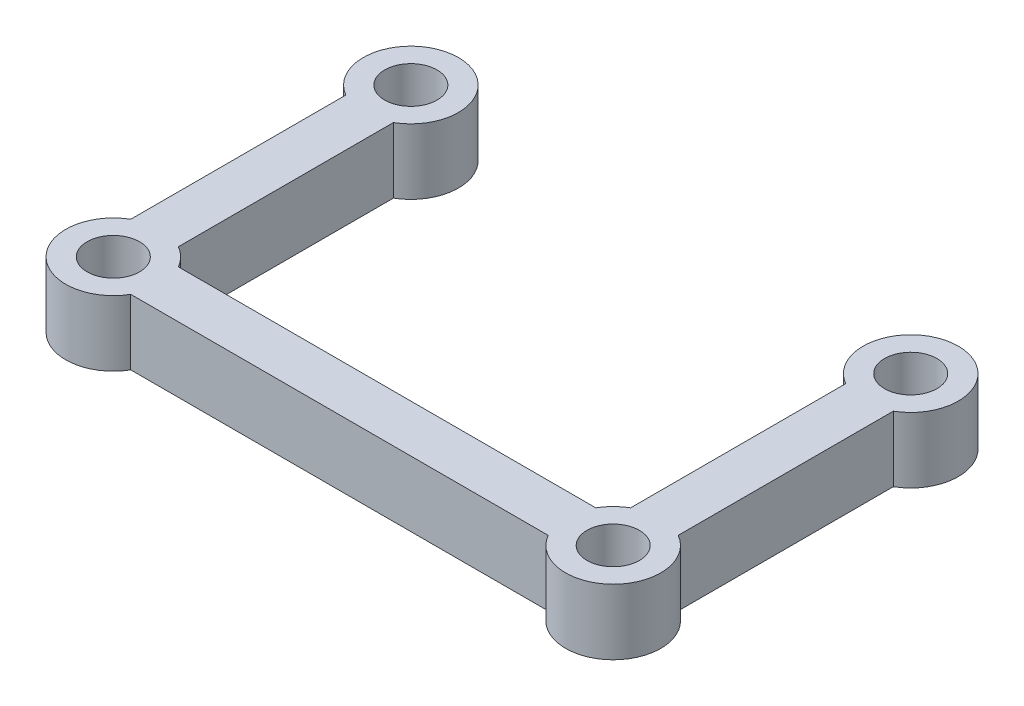
ISO-10303-21;
HEADER;
FILE_DESCRIPTION(('STEP AP214'),'2;1');
FILE_NAME('part.step','',(''),(''),'','','');
FILE_SCHEMA(('AUTOMOTIVE_DESIGN { 1 0 10303 214 1 1 1 1 }'));
ENDSEC;
DATA;
#1=APPLICATION_CONTEXT('core data for automotive mechanical design processes');
#2=APPLICATION_PROTOCOL_DEFINITION('international standard','automotive_design',2000,#1);
#3=PRODUCT_CONTEXT('',#1,'mechanical');
#4=PRODUCT('Part','Part','',(#3));
#5=PRODUCT_RELATED_PRODUCT_CATEGORY('part','',(#4));
#6=PRODUCT_DEFINITION_FORMATION('','',#4);
#7=PRODUCT_DEFINITION_CONTEXT('part definition',#1,'design');
#8=PRODUCT_DEFINITION('design','',#6,#7);
#9=PRODUCT_DEFINITION_SHAPE('','',#8);
#10=(LENGTH_UNIT() NAMED_UNIT(*) SI_UNIT(.MILLI.,.METRE.));
#11=(NAMED_UNIT(*) PLANE_ANGLE_UNIT() SI_UNIT($,.RADIAN.));
#12=(NAMED_UNIT(*) SI_UNIT($,.STERADIAN.) SOLID_ANGLE_UNIT());
#13=UNCERTAINTY_MEASURE_WITH_UNIT(LENGTH_MEASURE(1.E-05),#10,'distance_accuracy_value','');
#14=(GEOMETRIC_REPRESENTATION_CONTEXT(3) GLOBAL_UNCERTAINTY_ASSIGNED_CONTEXT((#13)) GLOBAL_UNIT_ASSIGNED_CONTEXT((#10,
#11,#12)) REPRESENTATION_CONTEXT('',''));
#15=CARTESIAN_POINT('',(0.,0.,0.));
#16=DIRECTION('',(0.,0.,1.));
#17=DIRECTION('',(1.,0.,0.));
#18=AXIS2_PLACEMENT_3D('',#15,#16,#17);
#19=CARTESIAN_POINT('',(-21.,2.75,0.));
#20=DIRECTION('',(0.,-1.,0.));
#21=DIRECTION('',(0.,0.,-1.));
#22=AXIS2_PLACEMENT_3D('',#19,#20,#21);
#23=CYLINDRICAL_SURFACE('',#22,2.);
#24=CARTESIAN_POINT('',(-21.,0.,0.));
#25=DIRECTION('',(0.,1.,0.));
#26=DIRECTION('',(0.,0.,1.));
#27=AXIS2_PLACEMENT_3D('',#24,#25,#26);
#28=CIRCLE('',#27,2.);
#29=CARTESIAN_POINT('',(-19.2679491924311,0.,-1.));
#30=VERTEX_POINT('',#29);
#31=CARTESIAN_POINT('',(-20.,0.,-1.73205080756887));
#32=VERTEX_POINT('',#31);
#33=EDGE_CURVE('E164',#30,#32,#28,.T.);
#34=ORIENTED_EDGE('',*,*,#33,.T.);
#35=DIRECTION('',(0.,-1.,0.));
#36=VECTOR('',#35,1.);
#37=CARTESIAN_POINT('',(-20.,2.75,-1.73205080756887));
#38=LINE('',#37,#36);
#39=CARTESIAN_POINT('',(-20.,2.75,-1.73205080756887));
#40=VERTEX_POINT('',#39);
#41=EDGE_CURVE('E11',#40,#32,#38,.T.);
#42=ORIENTED_EDGE('',*,*,#41,.F.);
#43=CARTESIAN_POINT('',(-21.,2.75,0.));
#44=DIRECTION('',(0.,1.,0.));
#45=DIRECTION('',(0.,0.,1.));
#46=AXIS2_PLACEMENT_3D('',#43,#44,#45);
#47=CIRCLE('',#46,2.);
#48=CARTESIAN_POINT('',(-19.2679491924311,2.75,-1.));
#49=VERTEX_POINT('',#48);
#50=EDGE_CURVE('E199',#49,#40,#47,.T.);
#51=ORIENTED_EDGE('',*,*,#50,.F.);
#52=DIRECTION('',(0.,-1.,0.));
#53=VECTOR('',#52,1.);
#54=CARTESIAN_POINT('',(-19.2679491924311,2.75,-1.));
#55=LINE('',#54,#53);
#56=EDGE_CURVE('E160',#49,#30,#55,.T.);
#57=ORIENTED_EDGE('',*,*,#56,.T.);
#58=EDGE_LOOP('',(#34,#42,#51,#57));
#59=FACE_BOUND('',#58,.T.);
#60=ADVANCED_FACE('F39',(#59),#23,.T.);
#61=CARTESIAN_POINT('',(-20.,2.75,-10.7679491924311));
#62=DIRECTION('',(-1.,0.,0.));
#63=DIRECTION('',(0.,0.,1.));
#64=AXIS2_PLACEMENT_3D('',#61,#62,#63);
#65=PLANE('',#64);
#66=DIRECTION('',(0.,0.,-1.));
#67=VECTOR('',#66,1.);
#68=CARTESIAN_POINT('',(-20.,0.,-10.7679491924311));
#69=LINE('',#68,#67);
#70=CARTESIAN_POINT('',(-20.,0.,-10.7679491924311));
#71=VERTEX_POINT('',#70);
#72=EDGE_CURVE('E168',#32,#71,#69,.T.);
#73=ORIENTED_EDGE('',*,*,#72,.T.);
#74=DIRECTION('',(0.,-1.,0.));
#75=VECTOR('',#74,1.);
#76=CARTESIAN_POINT('',(-20.,2.75,-10.7679491924311));
#77=LINE('',#76,#75);
#78=CARTESIAN_POINT('',(-20.,2.75,-10.7679491924311));
#79=VERTEX_POINT('',#78);
#80=EDGE_CURVE('E48',#79,#71,#77,.T.);
#81=ORIENTED_EDGE('',*,*,#80,.F.);
#82=DIRECTION('',(0.,0.,-1.));
#83=VECTOR('',#82,1.);
#84=CARTESIAN_POINT('',(-20.,2.75,-10.7679491924311));
#85=LINE('',#84,#83);
#86=EDGE_CURVE('E111',#40,#79,#85,.T.);
#87=ORIENTED_EDGE('',*,*,#86,.F.);
#88=ORIENTED_EDGE('',*,*,#41,.T.);
#89=EDGE_LOOP('',(#73,#81,#87,#88));
#90=FACE_BOUND('',#89,.T.);
#91=ADVANCED_FACE('F294',(#90),#65,.F.);
#92=CARTESIAN_POINT('',(-21.,2.75,-12.5));
#93=DIRECTION('',(0.,-1.,0.));
#94=DIRECTION('',(0.,0.,-1.));
#95=AXIS2_PLACEMENT_3D('',#92,#93,#94);
#96=CYLINDRICAL_SURFACE('',#95,2.);
#97=CARTESIAN_POINT('',(-21.,0.,-12.5));
#98=DIRECTION('',(0.,1.,0.));
#99=DIRECTION('',(0.,0.,1.));
#100=AXIS2_PLACEMENT_3D('',#97,#98,#99);
#101=CIRCLE('',#100,2.);
#102=CARTESIAN_POINT('',(-22.,0.,-10.7679491924311));
#103=VERTEX_POINT('',#102);
#104=EDGE_CURVE('E172',#71,#103,#101,.T.);
#105=ORIENTED_EDGE('',*,*,#104,.T.);
#106=DIRECTION('',(0.,-1.,0.));
#107=VECTOR('',#106,1.);
#108=CARTESIAN_POINT('',(-22.,2.75,-10.7679491924311));
#109=LINE('',#108,#107);
#110=CARTESIAN_POINT('',(-22.,2.75,-10.7679491924311));
#111=VERTEX_POINT('',#110);
#112=EDGE_CURVE('E226',#111,#103,#109,.T.);
#113=ORIENTED_EDGE('',*,*,#112,.F.);
#114=CARTESIAN_POINT('',(-21.,2.75,-12.5));
#115=DIRECTION('',(0.,1.,0.));
#116=DIRECTION('',(0.,0.,1.));
#117=AXIS2_PLACEMENT_3D('',#114,#115,#116);
#118=CIRCLE('',#117,2.);
#119=EDGE_CURVE('E236',#79,#111,#118,.T.);
#120=ORIENTED_EDGE('',*,*,#119,.F.);
#121=ORIENTED_EDGE('',*,*,#80,.T.);
#122=EDGE_LOOP('',(#105,#113,#120,#121));
#123=FACE_BOUND('',#122,.T.);
#124=ADVANCED_FACE('F234',(#123),#96,.T.);
#125=CARTESIAN_POINT('',(-22.,2.75,-10.7679491924311));
#126=DIRECTION('',(1.,0.,0.));
#127=DIRECTION('',(0.,0.,-1.));
#128=AXIS2_PLACEMENT_3D('',#125,#126,#127);
#129=PLANE('',#128);
#130=DIRECTION('',(0.,0.,1.));
#131=VECTOR('',#130,1.);
#132=CARTESIAN_POINT('',(-22.,0.,-10.7679491924311));
#133=LINE('',#132,#131);
#134=CARTESIAN_POINT('',(-22.,0.,-1.73205080756888));
#135=VERTEX_POINT('',#134);
#136=EDGE_CURVE('E175',#103,#135,#133,.T.);
#137=ORIENTED_EDGE('',*,*,#136,.T.);
#138=DIRECTION('',(0.,-1.,0.));
#139=VECTOR('',#138,1.);
#140=CARTESIAN_POINT('',(-22.,2.75,-1.73205080756888));
#141=LINE('',#140,#139);
#142=CARTESIAN_POINT('',(-22.,2.75,-1.73205080756888));
#143=VERTEX_POINT('',#142);
#144=EDGE_CURVE('E222',#143,#135,#141,.T.);
#145=ORIENTED_EDGE('',*,*,#144,.F.);
#146=DIRECTION('',(0.,0.,1.));
#147=VECTOR('',#146,1.);
#148=CARTESIAN_POINT('',(-22.,2.75,-10.7679491924311));
#149=LINE('',#148,#147);
#150=EDGE_CURVE('E255',#111,#143,#149,.T.);
#151=ORIENTED_EDGE('',*,*,#150,.F.);
#152=ORIENTED_EDGE('',*,*,#112,.T.);
#153=EDGE_LOOP('',(#137,#145,#151,#152));
#154=FACE_BOUND('',#153,.T.);
#155=ADVANCED_FACE('F245',(#154),#129,.F.);
#156=CARTESIAN_POINT('',(-21.,2.75,0.));
#157=DIRECTION('',(0.,-1.,0.));
#158=DIRECTION('',(0.,0.,-1.));
#159=AXIS2_PLACEMENT_3D('',#156,#157,#158);
#160=CYLINDRICAL_SURFACE('',#159,2.);
#161=CARTESIAN_POINT('',(-21.,0.,0.));
#162=DIRECTION('',(0.,1.,0.));
#163=DIRECTION('',(0.,0.,1.));
#164=AXIS2_PLACEMENT_3D('',#161,#162,#163);
#165=CIRCLE('',#164,2.);
#166=CARTESIAN_POINT('',(-19.2679491924311,0.,1.));
#167=VERTEX_POINT('',#166);
#168=EDGE_CURVE('E178',#135,#167,#165,.T.);
#169=ORIENTED_EDGE('',*,*,#168,.T.);
#170=DIRECTION('',(0.,-1.,0.));
#171=VECTOR('',#170,1.);
#172=CARTESIAN_POINT('',(-19.2679491924311,2.75,1.));
#173=LINE('',#172,#171);
#174=CARTESIAN_POINT('',(-19.2679491924311,2.75,1.));
#175=VERTEX_POINT('',#174);
#176=EDGE_CURVE('E218',#175,#167,#173,.T.);
#177=ORIENTED_EDGE('',*,*,#176,.F.);
#178=CARTESIAN_POINT('',(-21.,2.75,0.));
#179=DIRECTION('',(0.,1.,0.));
#180=DIRECTION('',(0.,0.,1.));
#181=AXIS2_PLACEMENT_3D('',#178,#179,#180);
#182=CIRCLE('',#181,2.);
#183=EDGE_CURVE('E251',#143,#175,#182,.T.);
#184=ORIENTED_EDGE('',*,*,#183,.F.);
#185=ORIENTED_EDGE('',*,*,#144,.T.);
#186=EDGE_LOOP('',(#169,#177,#184,#185));
#187=FACE_BOUND('',#186,.T.);
#188=ADVANCED_FACE('F249',(#187),#160,.T.);
#189=CARTESIAN_POINT('',(-19.2679491924311,2.75,1.));
#190=DIRECTION('',(0.,0.,-1.));
#191=DIRECTION('',(-1.,0.,0.));
#192=AXIS2_PLACEMENT_3D('',#189,#190,#191);
#193=PLANE('',#192);
#194=DIRECTION('',(1.,0.,0.));
#195=VECTOR('',#194,1.);
#196=CARTESIAN_POINT('',(-19.2679491924311,0.,1.));
#197=LINE('',#196,#195);
#198=CARTESIAN_POINT('',(-1.73205080756888,0.,0.999999999999999));
#199=VERTEX_POINT('',#198);
#200=EDGE_CURVE('E181',#167,#199,#197,.T.);
#201=ORIENTED_EDGE('',*,*,#200,.T.);
#202=DIRECTION('',(0.,-1.,0.));
#203=VECTOR('',#202,1.);
#204=CARTESIAN_POINT('',(-1.73205080756888,2.75,0.999999999999999));
#205=LINE('',#204,#203);
#206=CARTESIAN_POINT('',(-1.73205080756888,2.75,0.999999999999999));
#207=VERTEX_POINT('',#206);
#208=EDGE_CURVE('E214',#207,#199,#205,.T.);
#209=ORIENTED_EDGE('',*,*,#208,.F.);
#210=DIRECTION('',(1.,0.,0.));
#211=VECTOR('',#210,1.);
#212=CARTESIAN_POINT('',(-19.2679491924311,2.75,1.));
#213=LINE('',#212,#211);
#214=EDGE_CURVE('E254',#175,#207,#213,.T.);
#215=ORIENTED_EDGE('',*,*,#214,.F.);
#216=ORIENTED_EDGE('',*,*,#176,.T.);
#217=EDGE_LOOP('',(#201,#209,#215,#216));
#218=FACE_BOUND('',#217,.T.);
#219=ADVANCED_FACE('F307',(#218),#193,.F.);
#220=CARTESIAN_POINT('',(0.,2.75,0.));
#221=DIRECTION('',(0.,-1.,0.));
#222=DIRECTION('',(0.,0.,-1.));
#223=AXIS2_PLACEMENT_3D('',#220,#221,#222);
#224=CYLINDRICAL_SURFACE('',#223,2.);
#225=CARTESIAN_POINT('',(0.,0.,0.));
#226=DIRECTION('',(0.,1.,0.));
#227=DIRECTION('',(0.,0.,1.));
#228=AXIS2_PLACEMENT_3D('',#225,#226,#227);
#229=CIRCLE('',#228,2.);
#230=CARTESIAN_POINT('',(1.,0.,-1.73205080756888));
#231=VERTEX_POINT('',#230);
#232=EDGE_CURVE('E184',#199,#231,#229,.T.);
#233=ORIENTED_EDGE('',*,*,#232,.T.);
#234=DIRECTION('',(0.,-1.,0.));
#235=VECTOR('',#234,1.);
#236=CARTESIAN_POINT('',(1.,2.75,-1.73205080756888));
#237=LINE('',#236,#235);
#238=CARTESIAN_POINT('',(1.,2.75,-1.73205080756888));
#239=VERTEX_POINT('',#238);
#240=EDGE_CURVE('E210',#239,#231,#237,.T.);
#241=ORIENTED_EDGE('',*,*,#240,.F.);
#242=CARTESIAN_POINT('',(0.,2.75,0.));
#243=DIRECTION('',(0.,1.,0.));
#244=DIRECTION('',(0.,0.,1.));
#245=AXIS2_PLACEMENT_3D('',#242,#243,#244);
#246=CIRCLE('',#245,2.);
#247=EDGE_CURVE('E259',#207,#239,#246,.T.);
#248=ORIENTED_EDGE('',*,*,#247,.F.);
#249=ORIENTED_EDGE('',*,*,#208,.T.);
#250=EDGE_LOOP('',(#233,#241,#248,#249));
#251=FACE_BOUND('',#250,.T.);
#252=ADVANCED_FACE('F310',(#251),#224,.T.);
#253=CARTESIAN_POINT('',(1.,2.75,-10.7679491924311));
#254=DIRECTION('',(-1.,0.,0.));
#255=DIRECTION('',(0.,0.,1.));
#256=AXIS2_PLACEMENT_3D('',#253,#254,#255);
#257=PLANE('',#256);
#258=DIRECTION('',(0.,0.,-1.));
#259=VECTOR('',#258,1.);
#260=CARTESIAN_POINT('',(1.,0.,-10.7679491924311));
#261=LINE('',#260,#259);
#262=CARTESIAN_POINT('',(1.,0.,-10.7679491924311));
#263=VERTEX_POINT('',#262);
#264=EDGE_CURVE('E187',#231,#263,#261,.T.);
#265=ORIENTED_EDGE('',*,*,#264,.T.);
#266=DIRECTION('',(0.,-1.,0.));
#267=VECTOR('',#266,1.);
#268=CARTESIAN_POINT('',(1.,2.75,-10.7679491924311));
#269=LINE('',#268,#267);
#270=CARTESIAN_POINT('',(1.,2.75,-10.7679491924311));
#271=VERTEX_POINT('',#270);
#272=EDGE_CURVE('E206',#271,#263,#269,.T.);
#273=ORIENTED_EDGE('',*,*,#272,.F.);
#274=DIRECTION('',(0.,0.,-1.));
#275=VECTOR('',#274,1.);
#276=CARTESIAN_POINT('',(1.,2.75,-10.7679491924311));
#277=LINE('',#276,#275);
#278=EDGE_CURVE('E266',#239,#271,#277,.T.);
#279=ORIENTED_EDGE('',*,*,#278,.F.);
#280=ORIENTED_EDGE('',*,*,#240,.T.);
#281=EDGE_LOOP('',(#265,#273,#279,#280));
#282=FACE_BOUND('',#281,.T.);
#283=ADVANCED_FACE('F274',(#282),#257,.F.);
#284=CARTESIAN_POINT('',(0.,2.75,-12.5));
#285=DIRECTION('',(0.,-1.,0.));
#286=DIRECTION('',(0.,0.,-1.));
#287=AXIS2_PLACEMENT_3D('',#284,#285,#286);
#288=CYLINDRICAL_SURFACE('',#287,2.);
#289=CARTESIAN_POINT('',(0.,0.,-12.5));
#290=DIRECTION('',(0.,1.,0.));
#291=DIRECTION('',(0.,0.,1.));
#292=AXIS2_PLACEMENT_3D('',#289,#290,#291);
#293=CIRCLE('',#292,2.);
#294=CARTESIAN_POINT('',(-1.,0.,-10.7679491924311));
#295=VERTEX_POINT('',#294);
#296=EDGE_CURVE('E190',#263,#295,#293,.T.);
#297=ORIENTED_EDGE('',*,*,#296,.T.);
#298=DIRECTION('',(0.,-1.,0.));
#299=VECTOR('',#298,1.);
#300=CARTESIAN_POINT('',(-1.,2.75,-10.7679491924311));
#301=LINE('',#300,#299);
#302=CARTESIAN_POINT('',(-1.,2.75,-10.7679491924311));
#303=VERTEX_POINT('',#302);
#304=EDGE_CURVE('E153',#303,#295,#301,.T.);
#305=ORIENTED_EDGE('',*,*,#304,.F.);
#306=CARTESIAN_POINT('',(0.,2.75,-12.5));
#307=DIRECTION('',(0.,1.,0.));
#308=DIRECTION('',(0.,0.,1.));
#309=AXIS2_PLACEMENT_3D('',#306,#307,#308);
#310=CIRCLE('',#309,2.);
#311=EDGE_CURVE('E142',#271,#303,#310,.T.);
#312=ORIENTED_EDGE('',*,*,#311,.F.);
#313=ORIENTED_EDGE('',*,*,#272,.T.);
#314=EDGE_LOOP('',(#297,#305,#312,#313));
#315=FACE_BOUND('',#314,.T.);
#316=ADVANCED_FACE('F278',(#315),#288,.T.);
#317=CARTESIAN_POINT('',(-1.,2.75,-10.7679491924311));
#318=DIRECTION('',(1.,0.,0.));
#319=DIRECTION('',(0.,0.,-1.));
#320=AXIS2_PLACEMENT_3D('',#317,#318,#319);
#321=PLANE('',#320);
#322=DIRECTION('',(0.,0.,1.));
#323=VECTOR('',#322,1.);
#324=CARTESIAN_POINT('',(-1.,0.,-10.7679491924311));
#325=LINE('',#324,#323);
#326=CARTESIAN_POINT('',(-0.999999999999999,0.,-1.73205080756888));
#327=VERTEX_POINT('',#326);
#328=EDGE_CURVE('E151',#295,#327,#325,.T.);
#329=ORIENTED_EDGE('',*,*,#328,.T.);
#330=DIRECTION('',(0.,-1.,0.));
#331=VECTOR('',#330,1.);
#332=CARTESIAN_POINT('',(-0.999999999999999,2.75,-1.73205080756888));
#333=LINE('',#332,#331);
#334=CARTESIAN_POINT('',(-0.999999999999999,2.75,-1.73205080756888));
#335=VERTEX_POINT('',#334);
#336=EDGE_CURVE('E148',#335,#327,#333,.T.);
#337=ORIENTED_EDGE('',*,*,#336,.F.);
#338=DIRECTION('',(0.,0.,1.));
#339=VECTOR('',#338,1.);
#340=CARTESIAN_POINT('',(-1.,2.75,-10.7679491924311));
#341=LINE('',#340,#339);
#342=EDGE_CURVE('E136',#303,#335,#341,.T.);
#343=ORIENTED_EDGE('',*,*,#342,.F.);
#344=ORIENTED_EDGE('',*,*,#304,.T.);
#345=EDGE_LOOP('',(#329,#337,#343,#344));
#346=FACE_BOUND('',#345,.T.);
#347=ADVANCED_FACE('F149',(#346),#321,.F.);
#348=CARTESIAN_POINT('',(0.,2.75,0.));
#349=DIRECTION('',(0.,-1.,0.));
#350=DIRECTION('',(0.,0.,-1.));
#351=AXIS2_PLACEMENT_3D('',#348,#349,#350);
#352=CYLINDRICAL_SURFACE('',#351,2.);
#353=CARTESIAN_POINT('',(0.,0.,0.));
#354=DIRECTION('',(0.,1.,0.));
#355=DIRECTION('',(0.,0.,1.));
#356=AXIS2_PLACEMENT_3D('',#353,#354,#355);
#357=CIRCLE('',#356,2.);
#358=CARTESIAN_POINT('',(-1.73205080756888,0.,-1.));
#359=VERTEX_POINT('',#358);
#360=EDGE_CURVE('E97',#327,#359,#357,.T.);
#361=ORIENTED_EDGE('',*,*,#360,.T.);
#362=DIRECTION('',(0.,-1.,0.));
#363=VECTOR('',#362,1.);
#364=CARTESIAN_POINT('',(-1.73205080756888,2.75,-1.));
#365=LINE('',#364,#363);
#366=CARTESIAN_POINT('',(-1.73205080756888,2.75,-1.));
#367=VERTEX_POINT('',#366);
#368=EDGE_CURVE('E154',#367,#359,#365,.T.);
#369=ORIENTED_EDGE('',*,*,#368,.F.);
#370=CARTESIAN_POINT('',(0.,2.75,0.));
#371=DIRECTION('',(0.,1.,0.));
#372=DIRECTION('',(0.,0.,1.));
#373=AXIS2_PLACEMENT_3D('',#370,#371,#372);
#374=CIRCLE('',#373,2.);
#375=EDGE_CURVE('E140',#335,#367,#374,.T.);
#376=ORIENTED_EDGE('',*,*,#375,.F.);
#377=ORIENTED_EDGE('',*,*,#336,.T.);
#378=EDGE_LOOP('',(#361,#369,#376,#377));
#379=FACE_BOUND('',#378,.T.);
#380=ADVANCED_FACE('F156',(#379),#352,.T.);
#381=CARTESIAN_POINT('',(-19.2679491924311,2.75,-1.));
#382=DIRECTION('',(0.,0.,1.));
#383=DIRECTION('',(1.,0.,0.));
#384=AXIS2_PLACEMENT_3D('',#381,#382,#383);
#385=PLANE('',#384);
#386=DIRECTION('',(-1.,0.,0.));
#387=VECTOR('',#386,1.);
#388=CARTESIAN_POINT('',(-19.2679491924311,0.,-1.));
#389=LINE('',#388,#387);
#390=EDGE_CURVE('E103',#359,#30,#389,.T.);
#391=ORIENTED_EDGE('',*,*,#390,.T.);
#392=ORIENTED_EDGE('',*,*,#56,.F.);
#393=DIRECTION('',(-1.,0.,0.));
#394=VECTOR('',#393,1.);
#395=CARTESIAN_POINT('',(-19.2679491924311,2.75,-1.));
#396=LINE('',#395,#394);
#397=EDGE_CURVE('E56',#367,#49,#396,.T.);
#398=ORIENTED_EDGE('',*,*,#397,.F.);
#399=ORIENTED_EDGE('',*,*,#368,.T.);
#400=EDGE_LOOP('',(#391,#392,#398,#399));
#401=FACE_BOUND('',#400,.T.);
#402=ADVANCED_FACE('F282',(#401),#385,.F.);
#403=CARTESIAN_POINT('',(-21.,2.75,0.));
#404=DIRECTION('',(0.,1.,0.));
#405=DIRECTION('',(0.,0.,1.));
#406=AXIS2_PLACEMENT_3D('',#403,#404,#405);
#407=PLANE('',#406);
#408=CARTESIAN_POINT('',(-21.,2.75,0.));
#409=DIRECTION('',(0.,1.,0.));
#410=DIRECTION('',(0.,0.,1.));
#411=AXIS2_PLACEMENT_3D('',#408,#409,#410);
#412=CIRCLE('',#411,1.1);
#413=CARTESIAN_POINT('',(-21.,2.75,1.1));
#414=VERTEX_POINT('',#413);
#415=EDGE_CURVE('E393',#414,#414,#412,.T.);
#416=ORIENTED_EDGE('',*,*,#415,.F.);
#417=EDGE_LOOP('',(#416));
#418=FACE_BOUND('',#417,.T.);
#419=CARTESIAN_POINT('',(0.,2.75,0.));
#420=DIRECTION('',(0.,1.,0.));
#421=DIRECTION('',(0.,0.,1.));
#422=AXIS2_PLACEMENT_3D('',#419,#420,#421);
#423=CIRCLE('',#422,1.1);
#424=CARTESIAN_POINT('',(0.,2.75,1.1));
#425=VERTEX_POINT('',#424);
#426=EDGE_CURVE('E398',#425,#425,#423,.T.);
#427=ORIENTED_EDGE('',*,*,#426,.F.);
#428=EDGE_LOOP('',(#427));
#429=FACE_BOUND('',#428,.T.);
#430=CARTESIAN_POINT('',(0.,2.75,-12.5));
#431=DIRECTION('',(0.,1.,0.));
#432=DIRECTION('',(0.,0.,1.));
#433=AXIS2_PLACEMENT_3D('',#430,#431,#432);
#434=CIRCLE('',#433,1.1);
#435=CARTESIAN_POINT('',(0.,2.75,-11.4));
#436=VERTEX_POINT('',#435);
#437=EDGE_CURVE('E423',#436,#436,#434,.T.);
#438=ORIENTED_EDGE('',*,*,#437,.F.);
#439=EDGE_LOOP('',(#438));
#440=FACE_BOUND('',#439,.T.);
#441=CARTESIAN_POINT('',(-21.,2.75,-12.5));
#442=DIRECTION('',(0.,1.,0.));
#443=DIRECTION('',(0.,0.,1.));
#444=AXIS2_PLACEMENT_3D('',#441,#442,#443);
#445=CIRCLE('',#444,1.1);
#446=CARTESIAN_POINT('',(-21.,2.75,-11.4));
#447=VERTEX_POINT('',#446);
#448=EDGE_CURVE('E408',#447,#447,#445,.T.);
#449=ORIENTED_EDGE('',*,*,#448,.F.);
#450=EDGE_LOOP('',(#449));
#451=FACE_BOUND('',#450,.T.);
#452=ORIENTED_EDGE('',*,*,#50,.T.);
#453=ORIENTED_EDGE('',*,*,#86,.T.);
#454=ORIENTED_EDGE('',*,*,#119,.T.);
#455=ORIENTED_EDGE('',*,*,#150,.T.);
#456=ORIENTED_EDGE('',*,*,#183,.T.);
#457=ORIENTED_EDGE('',*,*,#214,.T.);
#458=ORIENTED_EDGE('',*,*,#247,.T.);
#459=ORIENTED_EDGE('',*,*,#278,.T.);
#460=ORIENTED_EDGE('',*,*,#311,.T.);
#461=ORIENTED_EDGE('',*,*,#342,.T.);
#462=ORIENTED_EDGE('',*,*,#375,.T.);
#463=ORIENTED_EDGE('',*,*,#397,.T.);
#464=EDGE_LOOP('',(#452,#453,#454,#455,#456,#457,#458,#459,#460,#461,#462,#463));
#465=FACE_BOUND('',#464,.T.);
#466=ADVANCED_FACE('F138',(#418,#429,#440,#451,#465),#407,.T.);
#467=CARTESIAN_POINT('',(-21.,0.,0.));
#468=DIRECTION('',(0.,1.,0.));
#469=DIRECTION('',(0.,0.,1.));
#470=AXIS2_PLACEMENT_3D('',#467,#468,#469);
#471=PLANE('',#470);
#472=CARTESIAN_POINT('',(-21.,0.,0.));
#473=DIRECTION('',(0.,1.,0.));
#474=DIRECTION('',(0.,0.,1.));
#475=AXIS2_PLACEMENT_3D('',#472,#473,#474);
#476=CIRCLE('',#475,1.1);
#477=CARTESIAN_POINT('',(-21.,0.,1.1));
#478=VERTEX_POINT('',#477);
#479=EDGE_CURVE('E396',#478,#478,#476,.F.);
#480=ORIENTED_EDGE('',*,*,#479,.F.);
#481=EDGE_LOOP('',(#480));
#482=FACE_BOUND('',#481,.T.);
#483=CARTESIAN_POINT('',(0.,0.,0.));
#484=DIRECTION('',(0.,1.,0.));
#485=DIRECTION('',(0.,0.,1.));
#486=AXIS2_PLACEMENT_3D('',#483,#484,#485);
#487=CIRCLE('',#486,1.1);
#488=CARTESIAN_POINT('',(0.,0.,1.1));
#489=VERTEX_POINT('',#488);
#490=EDGE_CURVE('E403',#489,#489,#487,.F.);
#491=ORIENTED_EDGE('',*,*,#490,.F.);
#492=EDGE_LOOP('',(#491));
#493=FACE_BOUND('',#492,.T.);
#494=CARTESIAN_POINT('',(0.,0.,-12.5));
#495=DIRECTION('',(0.,1.,0.));
#496=DIRECTION('',(0.,0.,1.));
#497=AXIS2_PLACEMENT_3D('',#494,#495,#496);
#498=CIRCLE('',#497,1.1);
#499=CARTESIAN_POINT('',(0.,0.,-11.4));
#500=VERTEX_POINT('',#499);
#501=EDGE_CURVE('E412',#500,#500,#498,.F.);
#502=ORIENTED_EDGE('',*,*,#501,.F.);
#503=EDGE_LOOP('',(#502));
#504=FACE_BOUND('',#503,.T.);
#505=CARTESIAN_POINT('',(-21.,0.,-12.5));
#506=DIRECTION('',(0.,1.,0.));
#507=DIRECTION('',(0.,0.,1.));
#508=AXIS2_PLACEMENT_3D('',#505,#506,#507);
#509=CIRCLE('',#508,1.1);
#510=CARTESIAN_POINT('',(-21.,0.,-11.4));
#511=VERTEX_POINT('',#510);
#512=EDGE_CURVE('E169',#511,#511,#509,.F.);
#513=ORIENTED_EDGE('',*,*,#512,.F.);
#514=EDGE_LOOP('',(#513));
#515=FACE_BOUND('',#514,.T.);
#516=ORIENTED_EDGE('',*,*,#33,.F.);
#517=ORIENTED_EDGE('',*,*,#390,.F.);
#518=ORIENTED_EDGE('',*,*,#360,.F.);
#519=ORIENTED_EDGE('',*,*,#328,.F.);
#520=ORIENTED_EDGE('',*,*,#296,.F.);
#521=ORIENTED_EDGE('',*,*,#264,.F.);
#522=ORIENTED_EDGE('',*,*,#232,.F.);
#523=ORIENTED_EDGE('',*,*,#200,.F.);
#524=ORIENTED_EDGE('',*,*,#168,.F.);
#525=ORIENTED_EDGE('',*,*,#136,.F.);
#526=ORIENTED_EDGE('',*,*,#104,.F.);
#527=ORIENTED_EDGE('',*,*,#72,.F.);
#528=EDGE_LOOP('',(#516,#517,#518,#519,#520,#521,#522,#523,#524,#525,#526,#527));
#529=FACE_BOUND('',#528,.T.);
#530=ADVANCED_FACE('F240',(#482,#493,#504,#515,#529),#471,.F.);
#531=CARTESIAN_POINT('',(-21.,-0.00100000000000013,-12.5));
#532=DIRECTION('',(0.,1.,0.));
#533=DIRECTION('',(0.,0.,1.));
#534=AXIS2_PLACEMENT_3D('',#531,#532,#533);
#535=CYLINDRICAL_SURFACE('',#534,1.1);
#536=ORIENTED_EDGE('',*,*,#448,.T.);
#537=EDGE_LOOP('',(#536));
#538=FACE_BOUND('',#537,.T.);
#539=ORIENTED_EDGE('',*,*,#512,.T.);
#540=EDGE_LOOP('',(#539));
#541=FACE_BOUND('',#540,.T.);
#542=ADVANCED_FACE('F347',(#538,#541),#535,.F.);
#543=CARTESIAN_POINT('',(0.,-0.00100000000000013,-12.5));
#544=DIRECTION('',(0.,1.,0.));
#545=DIRECTION('',(0.,0.,1.));
#546=AXIS2_PLACEMENT_3D('',#543,#544,#545);
#547=CYLINDRICAL_SURFACE('',#546,1.1);
#548=ORIENTED_EDGE('',*,*,#437,.T.);
#549=EDGE_LOOP('',(#548));
#550=FACE_BOUND('',#549,.T.);
#551=ORIENTED_EDGE('',*,*,#501,.T.);
#552=EDGE_LOOP('',(#551));
#553=FACE_BOUND('',#552,.T.);
#554=ADVANCED_FACE('F356',(#550,#553),#547,.F.);
#555=CARTESIAN_POINT('',(0.,-0.00100000000000013,0.));
#556=DIRECTION('',(0.,1.,0.));
#557=DIRECTION('',(0.,0.,1.));
#558=AXIS2_PLACEMENT_3D('',#555,#556,#557);
#559=CYLINDRICAL_SURFACE('',#558,1.1);
#560=ORIENTED_EDGE('',*,*,#426,.T.);
#561=EDGE_LOOP('',(#560));
#562=FACE_BOUND('',#561,.T.);
#563=ORIENTED_EDGE('',*,*,#490,.T.);
#564=EDGE_LOOP('',(#563));
#565=FACE_BOUND('',#564,.T.);
#566=ADVANCED_FACE('F366',(#562,#565),#559,.F.);
#567=CARTESIAN_POINT('',(-21.,-0.00100000000000013,0.));
#568=DIRECTION('',(0.,1.,0.));
#569=DIRECTION('',(0.,0.,1.));
#570=AXIS2_PLACEMENT_3D('',#567,#568,#569);
#571=CYLINDRICAL_SURFACE('',#570,1.1);
#572=ORIENTED_EDGE('',*,*,#415,.T.);
#573=EDGE_LOOP('',(#572));
#574=FACE_BOUND('',#573,.T.);
#575=ORIENTED_EDGE('',*,*,#479,.T.);
#576=EDGE_LOOP('',(#575));
#577=FACE_BOUND('',#576,.T.);
#578=ADVANCED_FACE('F376',(#574,#577),#571,.F.);
#579=CLOSED_SHELL('',(#60,#91,#124,#155,#188,#219,#252,#283,#316,#347,#380,#402,#466,#530,#542,
#554,#566,#578));
#580=MANIFOLD_SOLID_BREP('B2',#579);
#581=ADVANCED_BREP_SHAPE_REPRESENTATION('',(#18,#580),#14);
#582=SHAPE_DEFINITION_REPRESENTATION(#9,#581);
ENDSEC;
END-ISO-10303-21;
